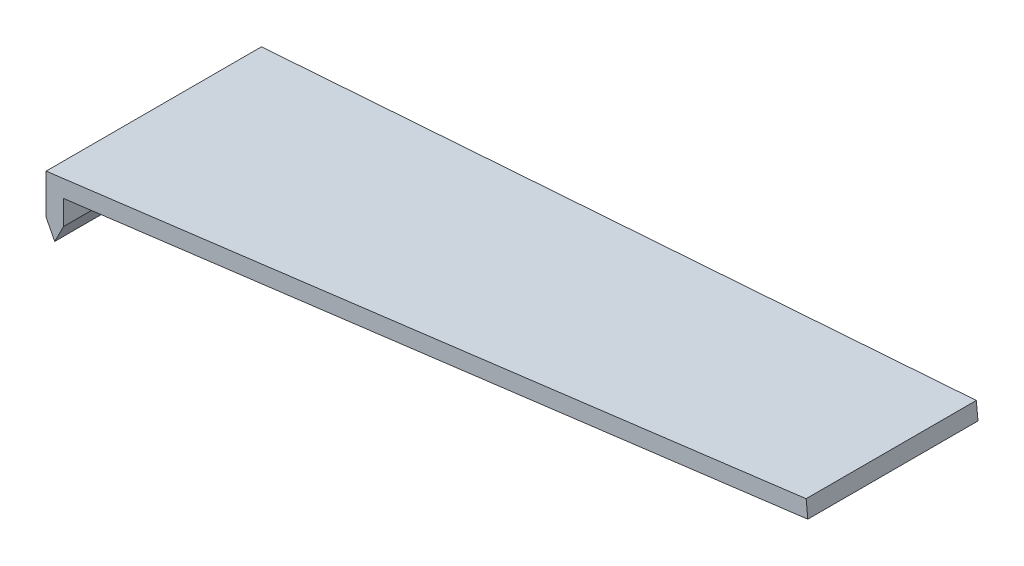
ISO-10303-21;
HEADER;
FILE_DESCRIPTION(('STEP AP214'),'2;1');
FILE_NAME('part.step','',(''),(''),'','','');
FILE_SCHEMA(('AUTOMOTIVE_DESIGN { 1 0 10303 214 1 1 1 1 }'));
ENDSEC;
DATA;
#1=APPLICATION_CONTEXT('core data for automotive mechanical design processes');
#2=APPLICATION_PROTOCOL_DEFINITION('international standard','automotive_design',2000,#1);
#3=PRODUCT_CONTEXT('',#1,'mechanical');
#4=PRODUCT('Part','Part','',(#3));
#5=PRODUCT_RELATED_PRODUCT_CATEGORY('part','',(#4));
#6=PRODUCT_DEFINITION_FORMATION('','',#4);
#7=PRODUCT_DEFINITION_CONTEXT('part definition',#1,'design');
#8=PRODUCT_DEFINITION('design','',#6,#7);
#9=PRODUCT_DEFINITION_SHAPE('','',#8);
#10=(LENGTH_UNIT() NAMED_UNIT(*) SI_UNIT(.MILLI.,.METRE.));
#11=(NAMED_UNIT(*) PLANE_ANGLE_UNIT() SI_UNIT($,.RADIAN.));
#12=(NAMED_UNIT(*) SI_UNIT($,.STERADIAN.) SOLID_ANGLE_UNIT());
#13=UNCERTAINTY_MEASURE_WITH_UNIT(LENGTH_MEASURE(1.E-05),#10,'distance_accuracy_value','');
#14=(GEOMETRIC_REPRESENTATION_CONTEXT(3) GLOBAL_UNCERTAINTY_ASSIGNED_CONTEXT((#13)) GLOBAL_UNIT_ASSIGNED_CONTEXT((#10,
#11,#12)) REPRESENTATION_CONTEXT('',''));
#15=CARTESIAN_POINT('',(0.,0.,0.));
#16=DIRECTION('',(0.,0.,1.));
#17=DIRECTION('',(1.,0.,0.));
#18=AXIS2_PLACEMENT_3D('',#15,#16,#17);
#19=CARTESIAN_POINT('',(-8.55,4.5,4.8));
#20=DIRECTION('',(-0.894427190999916,0.447213595499958,0.));
#21=DIRECTION('',(-0.447213595499958,-0.894427190999916,0.));
#22=AXIS2_PLACEMENT_3D('',#19,#20,#21);
#23=PLANE('',#22);
#24=DIRECTION('',(-0.447154471544713,-0.894308943089432,-0.0162601626016261));
#25=VECTOR('',#24,1.);
#26=CARTESIAN_POINT('',(-8.4,4.8,1.00909090909091));
#27=LINE('',#26,#25);
#28=CARTESIAN_POINT('',(-8.4,4.8,1.00909090909091));
#29=VERTEX_POINT('',#28);
#30=CARTESIAN_POINT('',(-8.55,4.5,1.00363636363636));
#31=VERTEX_POINT('',#30);
#32=EDGE_CURVE('E72',#29,#31,#27,.T.);
#33=ORIENTED_EDGE('',*,*,#32,.F.);
#34=DIRECTION('',(0.,0.,1.));
#35=VECTOR('',#34,1.);
#36=CARTESIAN_POINT('',(-8.4,4.8,4.8));
#37=LINE('',#36,#35);
#38=CARTESIAN_POINT('',(-8.4,4.8,4.79090909090909));
#39=VERTEX_POINT('',#38);
#40=EDGE_CURVE('E80',#29,#39,#37,.T.);
#41=ORIENTED_EDGE('',*,*,#40,.T.);
#42=DIRECTION('',(0.447154471544713,0.894308943089432,-0.0162601626016235));
#43=VECTOR('',#42,1.);
#44=CARTESIAN_POINT('',(-8.55,4.5,4.79636363636364));
#45=LINE('',#44,#43);
#46=CARTESIAN_POINT('',(-8.55,4.5,4.79636363636364));
#47=VERTEX_POINT('',#46);
#48=EDGE_CURVE('E19',#47,#39,#45,.T.);
#49=ORIENTED_EDGE('',*,*,#48,.F.);
#50=DIRECTION('',(0.,0.,1.));
#51=VECTOR('',#50,1.);
#52=CARTESIAN_POINT('',(-8.55,4.5,4.8));
#53=LINE('',#52,#51);
#54=EDGE_CURVE('E93',#47,#31,#53,.F.);
#55=ORIENTED_EDGE('',*,*,#54,.T.);
#56=EDGE_LOOP('',(#33,#41,#49,#55));
#57=FACE_BOUND('',#56,.T.);
#58=ADVANCED_FACE('F16',(#57),#23,.F.);
#59=CARTESIAN_POINT('',(-8.4,5.22850373136637,4.8));
#60=DIRECTION('',(-1.,0.,0.));
#61=DIRECTION('',(0.,-1.,0.));
#62=AXIS2_PLACEMENT_3D('',#59,#60,#61);
#63=PLANE('',#62);
#64=DIRECTION('',(0.,-0.999995408663393,-0.00303028911716029));
#65=VECTOR('',#64,1.);
#66=CARTESIAN_POINT('',(-8.4,5.22850373136637,1.01038940524656));
#67=LINE('',#66,#65);
#68=CARTESIAN_POINT('',(-8.4,5.22850373136637,1.01038940524656));
#69=VERTEX_POINT('',#68);
#70=EDGE_CURVE('E86',#69,#29,#67,.T.);
#71=ORIENTED_EDGE('',*,*,#70,.F.);
#72=DIRECTION('',(0.,0.,1.));
#73=VECTOR('',#72,1.);
#74=CARTESIAN_POINT('',(-8.4,5.22850373136637,4.8));
#75=LINE('',#74,#73);
#76=CARTESIAN_POINT('',(-8.4,5.22850373136637,4.78961059475344));
#77=VERTEX_POINT('',#76);
#78=EDGE_CURVE('E83',#69,#77,#75,.T.);
#79=ORIENTED_EDGE('',*,*,#78,.T.);
#80=DIRECTION('',(0.,0.999995408663393,-0.00303028911716029));
#81=VECTOR('',#80,1.);
#82=CARTESIAN_POINT('',(-8.4,4.8,4.79090909090909));
#83=LINE('',#82,#81);
#84=EDGE_CURVE('E77',#39,#77,#83,.T.);
#85=ORIENTED_EDGE('',*,*,#84,.F.);
#86=ORIENTED_EDGE('',*,*,#40,.F.);
#87=EDGE_LOOP('',(#71,#79,#85,#86));
#88=FACE_BOUND('',#87,.T.);
#89=ADVANCED_FACE('F79',(#88),#63,.F.);
#90=CARTESIAN_POINT('',(-8.7,4.8,4.8));
#91=DIRECTION('',(0.894427190999916,0.447213595499958,0.));
#92=DIRECTION('',(-0.447213595499958,0.894427190999916,0.));
#93=AXIS2_PLACEMENT_3D('',#90,#91,#92);
#94=PLANE('',#93);
#95=DIRECTION('',(-0.447187315291294,0.894374630582584,-0.0108409046131251));
#96=VECTOR('',#95,1.);
#97=CARTESIAN_POINT('',(-8.55,4.5,1.00363636363636));
#98=LINE('',#97,#96);
#99=CARTESIAN_POINT('',(-8.7,4.8,0.999999999999998));
#100=VERTEX_POINT('',#99);
#101=EDGE_CURVE('E95',#31,#100,#98,.T.);
#102=ORIENTED_EDGE('',*,*,#101,.F.);
#103=ORIENTED_EDGE('',*,*,#54,.F.);
#104=DIRECTION('',(-0.447187315291267,0.894374630582598,0.0108409046131215));
#105=VECTOR('',#104,1.);
#106=CARTESIAN_POINT('',(-8.55,4.5,4.79636363636364));
#107=LINE('',#106,#105);
#108=CARTESIAN_POINT('',(-8.7,4.80000000000002,4.8));
#109=VERTEX_POINT('',#108);
#110=EDGE_CURVE('E91',#47,#109,#107,.T.);
#111=ORIENTED_EDGE('',*,*,#110,.T.);
#112=DIRECTION('',(0.,0.,1.));
#113=VECTOR('',#112,1.);
#114=CARTESIAN_POINT('',(-8.7,4.80000000000003,4.8));
#115=LINE('',#114,#113);
#116=EDGE_CURVE('E107',#109,#100,#115,.F.);
#117=ORIENTED_EDGE('',*,*,#116,.T.);
#118=EDGE_LOOP('',(#102,#103,#111,#117));
#119=FACE_BOUND('',#118,.T.);
#120=ADVANCED_FACE('F105',(#119),#94,.F.);
#121=CARTESIAN_POINT('',(4.3298511157063,6.501488842937,4.8));
#122=DIRECTION('',(-0.099503719020999,0.995037190209989,0.));
#123=DIRECTION('',(-0.995037190209989,-0.099503719020999,0.));
#124=AXIS2_PLACEMENT_3D('',#121,#122,#123);
#125=PLANE('',#124);
#126=DIRECTION('',(0.994576084130848,0.099457608413085,0.0304400559082473));
#127=VECTOR('',#126,1.);
#128=CARTESIAN_POINT('',(-8.4,5.22850373136637,1.01038940524656));
#129=LINE('',#128,#127);
#130=CARTESIAN_POINT('',(4.3298511157063,6.501488842937,1.4));
#131=VERTEX_POINT('',#130);
#132=EDGE_CURVE('E119',#69,#131,#129,.T.);
#133=ORIENTED_EDGE('',*,*,#132,.T.);
#134=DIRECTION('',(0.,0.,1.));
#135=VECTOR('',#134,1.);
#136=CARTESIAN_POINT('',(4.3298511157063,6.501488842937,4.8));
#137=LINE('',#136,#135);
#138=CARTESIAN_POINT('',(4.3298511157063,6.501488842937,4.4));
#139=VERTEX_POINT('',#138);
#140=EDGE_CURVE('E125',#131,#139,#137,.T.);
#141=ORIENTED_EDGE('',*,*,#140,.T.);
#142=DIRECTION('',(-0.994576084130848,-0.099457608413085,0.0304400559082473));
#143=VECTOR('',#142,1.);
#144=CARTESIAN_POINT('',(4.3298511157063,6.501488842937,4.4));
#145=LINE('',#144,#143);
#146=EDGE_CURVE('E109',#139,#77,#145,.T.);
#147=ORIENTED_EDGE('',*,*,#146,.T.);
#148=ORIENTED_EDGE('',*,*,#78,.F.);
#149=EDGE_LOOP('',(#133,#141,#147,#148));
#150=FACE_BOUND('',#149,.T.);
#151=ADVANCED_FACE('F157',(#150),#125,.F.);
#152=CARTESIAN_POINT('',(4.52801832787828,4.5198167212172,4.4));
#153=DIRECTION('',(-0.0302889877007774,-0.00302889877007774,-0.999536594125649));
#154=DIRECTION('',(-0.999541179145381,0.,0.0302891266407693));
#155=AXIS2_PLACEMENT_3D('',#152,#153,#154);
#156=PLANE('',#155);
#157=ORIENTED_EDGE('',*,*,#48,.T.);
#158=ORIENTED_EDGE('',*,*,#84,.T.);
#159=ORIENTED_EDGE('',*,*,#146,.F.);
#160=DIRECTION('',(0.0995037190209986,-0.995037190209989,0.));
#161=VECTOR('',#160,1.);
#162=CARTESIAN_POINT('',(4.3,6.8,4.4));
#163=LINE('',#162,#161);
#164=CARTESIAN_POINT('',(4.3,6.8,4.4));
#165=VERTEX_POINT('',#164);
#166=EDGE_CURVE('E121',#139,#165,#163,.F.);
#167=ORIENTED_EDGE('',*,*,#166,.T.);
#168=DIRECTION('',(-0.994576084130848,-0.0994576084130848,0.0304400559082473));
#169=VECTOR('',#168,1.);
#170=CARTESIAN_POINT('',(4.3,6.8,4.4));
#171=LINE('',#170,#169);
#172=CARTESIAN_POINT('',(-8.7,5.5,4.79787878787879));
#173=VERTEX_POINT('',#172);
#174=EDGE_CURVE('E128',#165,#173,#171,.T.);
#175=ORIENTED_EDGE('',*,*,#174,.T.);
#176=DIRECTION('',(0.,-0.999995408663393,0.00303028911715924));
#177=VECTOR('',#176,1.);
#178=CARTESIAN_POINT('',(-8.7,5.5,4.79787878787879));
#179=LINE('',#178,#177);
#180=EDGE_CURVE('E114',#173,#109,#179,.T.);
#181=ORIENTED_EDGE('',*,*,#180,.T.);
#182=ORIENTED_EDGE('',*,*,#110,.F.);
#183=EDGE_LOOP('',(#157,#158,#159,#167,#175,#181,#182));
#184=FACE_BOUND('',#183,.T.);
#185=ADVANCED_FACE('F89',(#184),#156,.F.);
#186=CARTESIAN_POINT('',(-8.7,4.8,4.8));
#187=DIRECTION('',(1.,0.,0.));
#188=DIRECTION('',(0.,1.,0.));
#189=AXIS2_PLACEMENT_3D('',#186,#187,#188);
#190=PLANE('',#189);
#191=DIRECTION('',(0.,-0.999995408663393,-0.00303028911716187));
#192=VECTOR('',#191,1.);
#193=CARTESIAN_POINT('',(-8.7,5.5,1.00212121212121));
#194=LINE('',#193,#192);
#195=CARTESIAN_POINT('',(-8.7,5.5,1.00212121212121));
#196=VERTEX_POINT('',#195);
#197=EDGE_CURVE('E117',#196,#100,#194,.T.);
#198=ORIENTED_EDGE('',*,*,#197,.T.);
#199=ORIENTED_EDGE('',*,*,#116,.F.);
#200=ORIENTED_EDGE('',*,*,#180,.F.);
#201=DIRECTION('',(0.,0.,1.));
#202=VECTOR('',#201,1.);
#203=CARTESIAN_POINT('',(-8.7,5.5,4.8));
#204=LINE('',#203,#202);
#205=EDGE_CURVE('E131',#173,#196,#204,.F.);
#206=ORIENTED_EDGE('',*,*,#205,.T.);
#207=EDGE_LOOP('',(#198,#199,#200,#206));
#208=FACE_BOUND('',#207,.T.);
#209=ADVANCED_FACE('F140',(#208),#190,.F.);
#210=CARTESIAN_POINT('',(4.52801832787828,4.5198167212172,1.4));
#211=DIRECTION('',(-0.0302889877007774,-0.00302889877007774,0.999536594125649));
#212=DIRECTION('',(0.999541179145381,0.,0.0302891266407693));
#213=AXIS2_PLACEMENT_3D('',#210,#211,#212);
#214=PLANE('',#213);
#215=DIRECTION('',(0.0995037190209986,-0.995037190209989,0.));
#216=VECTOR('',#215,1.);
#217=CARTESIAN_POINT('',(4.3,6.8,1.4));
#218=LINE('',#217,#216);
#219=CARTESIAN_POINT('',(4.3,6.8,1.4));
#220=VERTEX_POINT('',#219);
#221=EDGE_CURVE('E33',#220,#131,#218,.T.);
#222=ORIENTED_EDGE('',*,*,#221,.T.);
#223=ORIENTED_EDGE('',*,*,#132,.F.);
#224=ORIENTED_EDGE('',*,*,#70,.T.);
#225=ORIENTED_EDGE('',*,*,#32,.T.);
#226=ORIENTED_EDGE('',*,*,#101,.T.);
#227=ORIENTED_EDGE('',*,*,#197,.F.);
#228=DIRECTION('',(0.994576084130848,0.0994576084130848,0.0304400559082473));
#229=VECTOR('',#228,1.);
#230=CARTESIAN_POINT('',(-8.7,5.5,1.00212121212121));
#231=LINE('',#230,#229);
#232=EDGE_CURVE('E25',#196,#220,#231,.T.);
#233=ORIENTED_EDGE('',*,*,#232,.T.);
#234=EDGE_LOOP('',(#222,#223,#224,#225,#226,#227,#233));
#235=FACE_BOUND('',#234,.T.);
#236=ADVANCED_FACE('F101',(#235),#214,.F.);
#237=CARTESIAN_POINT('',(4.3,6.8,4.8));
#238=DIRECTION('',(-0.995037190209989,-0.0995037190209986,0.));
#239=DIRECTION('',(0.0995037190209986,-0.995037190209989,0.));
#240=AXIS2_PLACEMENT_3D('',#237,#238,#239);
#241=PLANE('',#240);
#242=ORIENTED_EDGE('',*,*,#221,.F.);
#243=DIRECTION('',(0.,0.,1.));
#244=VECTOR('',#243,1.);
#245=CARTESIAN_POINT('',(4.3,6.8,4.8));
#246=LINE('',#245,#244);
#247=EDGE_CURVE('E11',#220,#165,#246,.T.);
#248=ORIENTED_EDGE('',*,*,#247,.T.);
#249=ORIENTED_EDGE('',*,*,#166,.F.);
#250=ORIENTED_EDGE('',*,*,#140,.F.);
#251=EDGE_LOOP('',(#242,#248,#249,#250));
#252=FACE_BOUND('',#251,.T.);
#253=ADVANCED_FACE('F142',(#252),#241,.F.);
#254=CARTESIAN_POINT('',(-8.7,5.5,4.8));
#255=DIRECTION('',(0.0995037190209989,-0.995037190209989,0.));
#256=DIRECTION('',(0.995037190209989,0.0995037190209989,0.));
#257=AXIS2_PLACEMENT_3D('',#254,#255,#256);
#258=PLANE('',#257);
#259=ORIENTED_EDGE('',*,*,#232,.F.);
#260=ORIENTED_EDGE('',*,*,#205,.F.);
#261=ORIENTED_EDGE('',*,*,#174,.F.);
#262=ORIENTED_EDGE('',*,*,#247,.F.);
#263=EDGE_LOOP('',(#259,#260,#261,#262));
#264=FACE_BOUND('',#263,.T.);
#265=ADVANCED_FACE('F138',(#264),#258,.F.);
#266=CLOSED_SHELL('',(#58,#89,#120,#151,#185,#209,#236,#253,#265));
#267=MANIFOLD_SOLID_BREP('B1',#266);
#268=ADVANCED_BREP_SHAPE_REPRESENTATION('',(#18,#267),#14);
#269=SHAPE_DEFINITION_REPRESENTATION(#9,#268);
ENDSEC;
END-ISO-10303-21;
